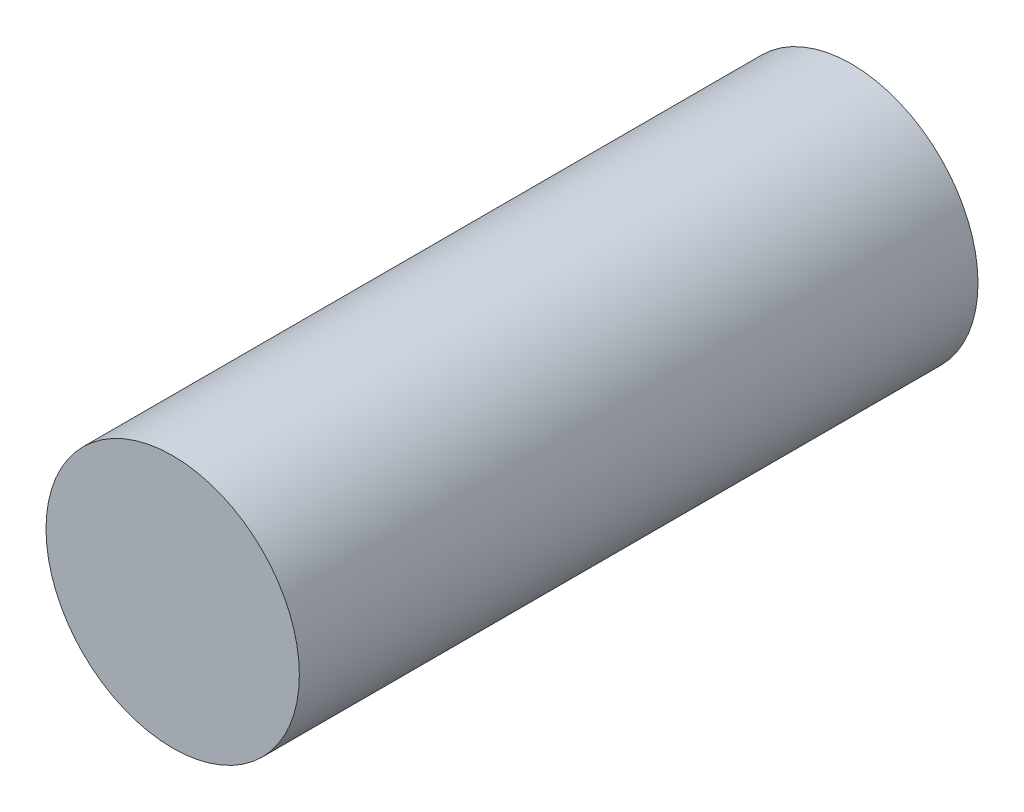
ISO-10303-21;
HEADER;
FILE_DESCRIPTION(('STEP AP214'),'2;1');
FILE_NAME('part.step','',(''),(''),'','','');
FILE_SCHEMA(('AUTOMOTIVE_DESIGN { 1 0 10303 214 1 1 1 1 }'));
ENDSEC;
DATA;
#1=APPLICATION_CONTEXT('core data for automotive mechanical design processes');
#2=APPLICATION_PROTOCOL_DEFINITION('international standard','automotive_design',2000,#1);
#3=PRODUCT_CONTEXT('',#1,'mechanical');
#4=PRODUCT('Part','Part','',(#3));
#5=PRODUCT_RELATED_PRODUCT_CATEGORY('part','',(#4));
#6=PRODUCT_DEFINITION_FORMATION('','',#4);
#7=PRODUCT_DEFINITION_CONTEXT('part definition',#1,'design');
#8=PRODUCT_DEFINITION('design','',#6,#7);
#9=PRODUCT_DEFINITION_SHAPE('','',#8);
#10=(LENGTH_UNIT() NAMED_UNIT(*) SI_UNIT(.MILLI.,.METRE.));
#11=(NAMED_UNIT(*) PLANE_ANGLE_UNIT() SI_UNIT($,.RADIAN.));
#12=(NAMED_UNIT(*) SI_UNIT($,.STERADIAN.) SOLID_ANGLE_UNIT());
#13=UNCERTAINTY_MEASURE_WITH_UNIT(LENGTH_MEASURE(1.E-05),#10,'distance_accuracy_value','');
#14=(GEOMETRIC_REPRESENTATION_CONTEXT(3) GLOBAL_UNCERTAINTY_ASSIGNED_CONTEXT((#13)) GLOBAL_UNIT_ASSIGNED_CONTEXT((#10,
#11,#12)) REPRESENTATION_CONTEXT('',''));
#15=CARTESIAN_POINT('',(0.,0.,0.));
#16=DIRECTION('',(0.,0.,1.));
#17=DIRECTION('',(1.,0.,0.));
#18=AXIS2_PLACEMENT_3D('',#15,#16,#17);
#19=CARTESIAN_POINT('',(0.,0.,30.));
#20=DIRECTION('',(0.,0.,-1.));
#21=DIRECTION('',(-1.,0.,0.));
#22=AXIS2_PLACEMENT_3D('',#19,#20,#21);
#23=CYLINDRICAL_SURFACE('',#22,5.6);
#24=CARTESIAN_POINT('',(0.,0.,30.));
#25=DIRECTION('',(0.,0.,1.));
#26=DIRECTION('',(1.,0.,0.));
#27=AXIS2_PLACEMENT_3D('',#24,#25,#26);
#28=CIRCLE('',#27,5.6);
#29=CARTESIAN_POINT('',(5.6,0.,30.));
#30=VERTEX_POINT('',#29);
#31=EDGE_CURVE('E10',#30,#30,#28,.T.);
#32=ORIENTED_EDGE('',*,*,#31,.F.);
#33=EDGE_LOOP('',(#32));
#34=FACE_BOUND('',#33,.T.);
#35=CARTESIAN_POINT('',(0.,0.,0.));
#36=DIRECTION('',(0.,0.,1.));
#37=DIRECTION('',(1.,0.,0.));
#38=AXIS2_PLACEMENT_3D('',#35,#36,#37);
#39=CIRCLE('',#38,5.6);
#40=CARTESIAN_POINT('',(5.6,0.,0.));
#41=VERTEX_POINT('',#40);
#42=EDGE_CURVE('E38',#41,#41,#39,.T.);
#43=ORIENTED_EDGE('',*,*,#42,.T.);
#44=EDGE_LOOP('',(#43));
#45=FACE_BOUND('',#44,.T.);
#46=ADVANCED_FACE('F35',(#34,#45),#23,.T.);
#47=CARTESIAN_POINT('',(0.,0.,30.));
#48=DIRECTION('',(0.,0.,1.));
#49=DIRECTION('',(1.,0.,0.));
#50=AXIS2_PLACEMENT_3D('',#47,#48,#49);
#51=PLANE('',#50);
#52=ORIENTED_EDGE('',*,*,#31,.T.);
#53=EDGE_LOOP('',(#52));
#54=FACE_BOUND('',#53,.T.);
#55=ADVANCED_FACE('F50',(#54),#51,.T.);
#56=CARTESIAN_POINT('',(0.,0.,0.));
#57=DIRECTION('',(0.,0.,1.));
#58=DIRECTION('',(1.,0.,0.));
#59=AXIS2_PLACEMENT_3D('',#56,#57,#58);
#60=PLANE('',#59);
#61=ORIENTED_EDGE('',*,*,#42,.F.);
#62=EDGE_LOOP('',(#61));
#63=FACE_BOUND('',#62,.T.);
#64=ADVANCED_FACE('F48',(#63),#60,.F.);
#65=CLOSED_SHELL('',(#46,#55,#64));
#66=MANIFOLD_SOLID_BREP('B2',#65);
#67=ADVANCED_BREP_SHAPE_REPRESENTATION('',(#18,#66),#14);
#68=SHAPE_DEFINITION_REPRESENTATION(#9,#67);
ENDSEC;
END-ISO-10303-21;
